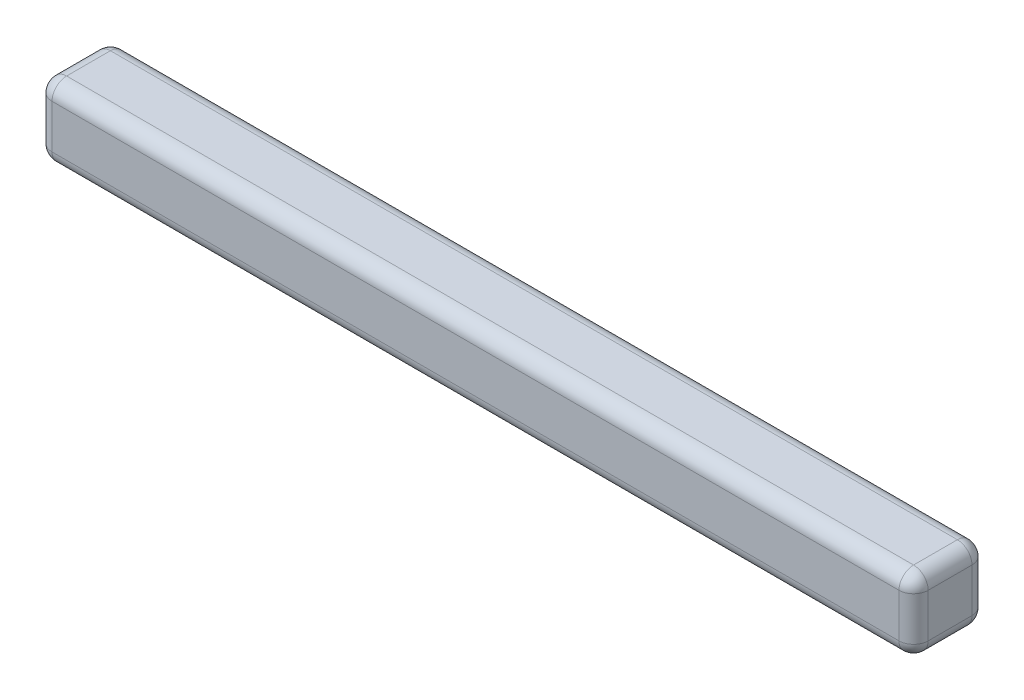
ISO-10303-21;
HEADER;
FILE_DESCRIPTION(('STEP AP214'),'2;1');
FILE_NAME('part.step','',(''),(''),'','','');
FILE_SCHEMA(('AUTOMOTIVE_DESIGN { 1 0 10303 214 1 1 1 1 }'));
ENDSEC;
DATA;
#1=APPLICATION_CONTEXT('core data for automotive mechanical design processes');
#2=APPLICATION_PROTOCOL_DEFINITION('international standard','automotive_design',2000,#1);
#3=PRODUCT_CONTEXT('',#1,'mechanical');
#4=PRODUCT('Part','Part','',(#3));
#5=PRODUCT_RELATED_PRODUCT_CATEGORY('part','',(#4));
#6=PRODUCT_DEFINITION_FORMATION('','',#4);
#7=PRODUCT_DEFINITION_CONTEXT('part definition',#1,'design');
#8=PRODUCT_DEFINITION('design','',#6,#7);
#9=PRODUCT_DEFINITION_SHAPE('','',#8);
#10=(LENGTH_UNIT() NAMED_UNIT(*) SI_UNIT(.MILLI.,.METRE.));
#11=(NAMED_UNIT(*) PLANE_ANGLE_UNIT() SI_UNIT($,.RADIAN.));
#12=(NAMED_UNIT(*) SI_UNIT($,.STERADIAN.) SOLID_ANGLE_UNIT());
#13=UNCERTAINTY_MEASURE_WITH_UNIT(LENGTH_MEASURE(1.E-05),#10,'distance_accuracy_value','');
#14=(GEOMETRIC_REPRESENTATION_CONTEXT(3) GLOBAL_UNCERTAINTY_ASSIGNED_CONTEXT((#13)) GLOBAL_UNIT_ASSIGNED_CONTEXT((#10,
#11,#12)) REPRESENTATION_CONTEXT('',''));
#15=CARTESIAN_POINT('',(0.,0.,0.));
#16=DIRECTION('',(0.,0.,1.));
#17=DIRECTION('',(1.,0.,0.));
#18=AXIS2_PLACEMENT_3D('',#15,#16,#17);
#19=CARTESIAN_POINT('',(30.,5.,-2.5));
#20=DIRECTION('',(-1.,0.,0.));
#21=DIRECTION('',(0.,0.,1.));
#22=AXIS2_PLACEMENT_3D('',#19,#20,#21);
#23=PLANE('',#22);
#24=DIRECTION('',(0.,-1.,0.));
#25=VECTOR('',#24,1.);
#26=CARTESIAN_POINT('',(30.,5.,1.5));
#27=LINE('',#26,#25);
#28=CARTESIAN_POINT('',(30.,4.,1.5));
#29=VERTEX_POINT('',#28);
#30=CARTESIAN_POINT('',(30.,1.,1.5));
#31=VERTEX_POINT('',#30);
#32=EDGE_CURVE('E132',#29,#31,#27,.T.);
#33=ORIENTED_EDGE('',*,*,#32,.T.);
#34=DIRECTION('',(0.,0.,-1.));
#35=VECTOR('',#34,1.);
#36=CARTESIAN_POINT('',(30.,1.,-2.5));
#37=LINE('',#36,#35);
#38=CARTESIAN_POINT('',(30.,1.,-1.5));
#39=VERTEX_POINT('',#38);
#40=EDGE_CURVE('E128',#31,#39,#37,.T.);
#41=ORIENTED_EDGE('',*,*,#40,.T.);
#42=DIRECTION('',(0.,-1.,0.));
#43=VECTOR('',#42,1.);
#44=CARTESIAN_POINT('',(30.,5.,-1.5));
#45=LINE('',#44,#43);
#46=CARTESIAN_POINT('',(30.,4.,-1.5));
#47=VERTEX_POINT('',#46);
#48=EDGE_CURVE('E121',#39,#47,#45,.F.);
#49=ORIENTED_EDGE('',*,*,#48,.T.);
#50=DIRECTION('',(0.,0.,-1.));
#51=VECTOR('',#50,1.);
#52=CARTESIAN_POINT('',(30.,4.,2.5));
#53=LINE('',#52,#51);
#54=EDGE_CURVE('E125',#47,#29,#53,.F.);
#55=ORIENTED_EDGE('',*,*,#54,.T.);
#56=EDGE_LOOP('',(#33,#41,#49,#55));
#57=FACE_BOUND('',#56,.T.);
#58=ADVANCED_FACE('F33',(#57),#23,.F.);
#59=CARTESIAN_POINT('',(-30.,5.,-2.5));
#60=DIRECTION('',(0.,0.,1.));
#61=DIRECTION('',(1.,0.,0.));
#62=AXIS2_PLACEMENT_3D('',#59,#60,#61);
#63=PLANE('',#62);
#64=DIRECTION('',(0.,-1.,0.));
#65=VECTOR('',#64,1.);
#66=CARTESIAN_POINT('',(29.,5.,-2.5));
#67=LINE('',#66,#65);
#68=CARTESIAN_POINT('',(29.,4.,-2.5));
#69=VERTEX_POINT('',#68);
#70=CARTESIAN_POINT('',(29.,1.,-2.5));
#71=VERTEX_POINT('',#70);
#72=EDGE_CURVE('E140',#69,#71,#67,.T.);
#73=ORIENTED_EDGE('',*,*,#72,.T.);
#74=DIRECTION('',(-1.,0.,0.));
#75=VECTOR('',#74,1.);
#76=CARTESIAN_POINT('',(-30.,1.,-2.5));
#77=LINE('',#76,#75);
#78=CARTESIAN_POINT('',(-29.,1.,-2.5));
#79=VERTEX_POINT('',#78);
#80=EDGE_CURVE('E178',#71,#79,#77,.T.);
#81=ORIENTED_EDGE('',*,*,#80,.T.);
#82=DIRECTION('',(0.,-1.,0.));
#83=VECTOR('',#82,1.);
#84=CARTESIAN_POINT('',(-29.,5.,-2.5));
#85=LINE('',#84,#83);
#86=CARTESIAN_POINT('',(-29.,4.,-2.5));
#87=VERTEX_POINT('',#86);
#88=EDGE_CURVE('E175',#79,#87,#85,.F.);
#89=ORIENTED_EDGE('',*,*,#88,.T.);
#90=DIRECTION('',(-1.,0.,0.));
#91=VECTOR('',#90,1.);
#92=CARTESIAN_POINT('',(30.,4.,-2.5));
#93=LINE('',#92,#91);
#94=EDGE_CURVE('E173',#87,#69,#93,.F.);
#95=ORIENTED_EDGE('',*,*,#94,.T.);
#96=EDGE_LOOP('',(#73,#81,#89,#95));
#97=FACE_BOUND('',#96,.T.);
#98=ADVANCED_FACE('F295',(#97),#63,.F.);
#99=CARTESIAN_POINT('',(-30.,5.,-2.5));
#100=DIRECTION('',(1.,0.,0.));
#101=DIRECTION('',(0.,0.,-1.));
#102=AXIS2_PLACEMENT_3D('',#99,#100,#101);
#103=PLANE('',#102);
#104=DIRECTION('',(0.,-1.,0.));
#105=VECTOR('',#104,1.);
#106=CARTESIAN_POINT('',(-30.,5.,-1.5));
#107=LINE('',#106,#105);
#108=CARTESIAN_POINT('',(-30.,4.,-1.5));
#109=VERTEX_POINT('',#108);
#110=CARTESIAN_POINT('',(-30.,1.,-1.5));
#111=VERTEX_POINT('',#110);
#112=EDGE_CURVE('E184',#109,#111,#107,.T.);
#113=ORIENTED_EDGE('',*,*,#112,.T.);
#114=DIRECTION('',(0.,0.,1.));
#115=VECTOR('',#114,1.);
#116=CARTESIAN_POINT('',(-30.,1.,-2.5));
#117=LINE('',#116,#115);
#118=CARTESIAN_POINT('',(-30.,1.,1.5));
#119=VERTEX_POINT('',#118);
#120=EDGE_CURVE('E187',#111,#119,#117,.T.);
#121=ORIENTED_EDGE('',*,*,#120,.T.);
#122=DIRECTION('',(0.,-1.,0.));
#123=VECTOR('',#122,1.);
#124=CARTESIAN_POINT('',(-30.,5.,1.5));
#125=LINE('',#124,#123);
#126=CARTESIAN_POINT('',(-30.,4.,1.5));
#127=VERTEX_POINT('',#126);
#128=EDGE_CURVE('E182',#119,#127,#125,.F.);
#129=ORIENTED_EDGE('',*,*,#128,.T.);
#130=DIRECTION('',(0.,0.,1.));
#131=VECTOR('',#130,1.);
#132=CARTESIAN_POINT('',(-30.,4.,-2.5));
#133=LINE('',#132,#131);
#134=EDGE_CURVE('E180',#127,#109,#133,.F.);
#135=ORIENTED_EDGE('',*,*,#134,.T.);
#136=EDGE_LOOP('',(#113,#121,#129,#135));
#137=FACE_BOUND('',#136,.T.);
#138=ADVANCED_FACE('F272',(#137),#103,.F.);
#139=CARTESIAN_POINT('',(-30.,5.,2.5));
#140=DIRECTION('',(0.,0.,-1.));
#141=DIRECTION('',(-1.,0.,0.));
#142=AXIS2_PLACEMENT_3D('',#139,#140,#141);
#143=PLANE('',#142);
#144=DIRECTION('',(0.,-1.,0.));
#145=VECTOR('',#144,1.);
#146=CARTESIAN_POINT('',(-29.,5.,2.5));
#147=LINE('',#146,#145);
#148=CARTESIAN_POINT('',(-29.,4.,2.5));
#149=VERTEX_POINT('',#148);
#150=CARTESIAN_POINT('',(-29.,1.,2.5));
#151=VERTEX_POINT('',#150);
#152=EDGE_CURVE('E166',#149,#151,#147,.T.);
#153=ORIENTED_EDGE('',*,*,#152,.T.);
#154=DIRECTION('',(1.,0.,0.));
#155=VECTOR('',#154,1.);
#156=CARTESIAN_POINT('',(-30.,1.,2.5));
#157=LINE('',#156,#155);
#158=CARTESIAN_POINT('',(29.,1.,2.5));
#159=VERTEX_POINT('',#158);
#160=EDGE_CURVE('E171',#151,#159,#157,.T.);
#161=ORIENTED_EDGE('',*,*,#160,.T.);
#162=DIRECTION('',(0.,-1.,0.));
#163=VECTOR('',#162,1.);
#164=CARTESIAN_POINT('',(29.,5.,2.5));
#165=LINE('',#164,#163);
#166=CARTESIAN_POINT('',(29.,4.,2.5));
#167=VERTEX_POINT('',#166);
#168=EDGE_CURVE('E168',#159,#167,#165,.F.);
#169=ORIENTED_EDGE('',*,*,#168,.T.);
#170=DIRECTION('',(1.,0.,0.));
#171=VECTOR('',#170,1.);
#172=CARTESIAN_POINT('',(-30.,4.,2.5));
#173=LINE('',#172,#171);
#174=EDGE_CURVE('E164',#167,#149,#173,.F.);
#175=ORIENTED_EDGE('',*,*,#174,.T.);
#176=EDGE_LOOP('',(#153,#161,#169,#175));
#177=FACE_BOUND('',#176,.T.);
#178=ADVANCED_FACE('F302',(#177),#143,.F.);
#179=CARTESIAN_POINT('',(0.,5.,0.));
#180=DIRECTION('',(0.,1.,0.));
#181=DIRECTION('',(0.,0.,1.));
#182=AXIS2_PLACEMENT_3D('',#179,#180,#181);
#183=PLANE('',#182);
#184=DIRECTION('',(0.,0.,1.));
#185=VECTOR('',#184,1.);
#186=CARTESIAN_POINT('',(-29.,5.,2.5));
#187=LINE('',#186,#185);
#188=CARTESIAN_POINT('',(-29.,5.,-1.5));
#189=VERTEX_POINT('',#188);
#190=CARTESIAN_POINT('',(-29.,5.,1.5));
#191=VERTEX_POINT('',#190);
#192=EDGE_CURVE('E42',#189,#191,#187,.T.);
#193=ORIENTED_EDGE('',*,*,#192,.T.);
#194=DIRECTION('',(1.,0.,0.));
#195=VECTOR('',#194,1.);
#196=CARTESIAN_POINT('',(30.,5.,1.5));
#197=LINE('',#196,#195);
#198=CARTESIAN_POINT('',(29.,5.,1.5));
#199=VERTEX_POINT('',#198);
#200=EDGE_CURVE('E11',#191,#199,#197,.T.);
#201=ORIENTED_EDGE('',*,*,#200,.T.);
#202=DIRECTION('',(0.,0.,-1.));
#203=VECTOR('',#202,1.);
#204=CARTESIAN_POINT('',(29.,5.,-2.5));
#205=LINE('',#204,#203);
#206=CARTESIAN_POINT('',(29.,5.,-1.5));
#207=VERTEX_POINT('',#206);
#208=EDGE_CURVE('E198',#199,#207,#205,.T.);
#209=ORIENTED_EDGE('',*,*,#208,.T.);
#210=DIRECTION('',(-1.,0.,0.));
#211=VECTOR('',#210,1.);
#212=CARTESIAN_POINT('',(-30.,5.,-1.5));
#213=LINE('',#212,#211);
#214=EDGE_CURVE('E53',#207,#189,#213,.T.);
#215=ORIENTED_EDGE('',*,*,#214,.T.);
#216=EDGE_LOOP('',(#193,#201,#209,#215));
#217=FACE_BOUND('',#216,.T.);
#218=ADVANCED_FACE('F365',(#217),#183,.T.);
#219=CARTESIAN_POINT('',(0.,0.,0.));
#220=DIRECTION('',(0.,1.,0.));
#221=DIRECTION('',(0.,0.,1.));
#222=AXIS2_PLACEMENT_3D('',#219,#220,#221);
#223=PLANE('',#222);
#224=DIRECTION('',(0.,0.,1.));
#225=VECTOR('',#224,1.);
#226=CARTESIAN_POINT('',(-29.,0.,0.));
#227=LINE('',#226,#225);
#228=CARTESIAN_POINT('',(-29.,0.,1.5));
#229=VERTEX_POINT('',#228);
#230=CARTESIAN_POINT('',(-29.,0.,-1.5));
#231=VERTEX_POINT('',#230);
#232=EDGE_CURVE('E193',#229,#231,#227,.F.);
#233=ORIENTED_EDGE('',*,*,#232,.T.);
#234=DIRECTION('',(-1.,0.,0.));
#235=VECTOR('',#234,1.);
#236=CARTESIAN_POINT('',(0.,0.,-1.5));
#237=LINE('',#236,#235);
#238=CARTESIAN_POINT('',(29.,0.,-1.5));
#239=VERTEX_POINT('',#238);
#240=EDGE_CURVE('E195',#231,#239,#237,.F.);
#241=ORIENTED_EDGE('',*,*,#240,.T.);
#242=DIRECTION('',(0.,0.,-1.));
#243=VECTOR('',#242,1.);
#244=CARTESIAN_POINT('',(29.,0.,0.));
#245=LINE('',#244,#243);
#246=CARTESIAN_POINT('',(29.,0.,1.5));
#247=VERTEX_POINT('',#246);
#248=EDGE_CURVE('E189',#239,#247,#245,.F.);
#249=ORIENTED_EDGE('',*,*,#248,.T.);
#250=DIRECTION('',(1.,0.,0.));
#251=VECTOR('',#250,1.);
#252=CARTESIAN_POINT('',(0.,0.,1.5));
#253=LINE('',#252,#251);
#254=EDGE_CURVE('E191',#247,#229,#253,.F.);
#255=ORIENTED_EDGE('',*,*,#254,.T.);
#256=EDGE_LOOP('',(#233,#241,#249,#255));
#257=FACE_BOUND('',#256,.T.);
#258=ADVANCED_FACE('F264',(#257),#223,.F.);
#259=CARTESIAN_POINT('',(-29.,5.,-1.5));
#260=DIRECTION('',(0.,-1.,0.));
#261=DIRECTION('',(0.,0.,-1.));
#262=AXIS2_PLACEMENT_3D('',#259,#260,#261);
#263=CYLINDRICAL_SURFACE('',#262,1.);
#264=CARTESIAN_POINT('',(-29.,4.,-1.5));
#265=DIRECTION('',(0.,1.,0.));
#266=DIRECTION('',(0.,0.,1.));
#267=AXIS2_PLACEMENT_3D('',#264,#265,#266);
#268=CIRCLE('',#267,1.);
#269=EDGE_CURVE('E37',#87,#109,#268,.T.);
#270=ORIENTED_EDGE('',*,*,#269,.F.);
#271=ORIENTED_EDGE('',*,*,#88,.F.);
#272=CARTESIAN_POINT('',(-29.,1.,-1.5));
#273=DIRECTION('',(0.,-1.,0.));
#274=DIRECTION('',(0.,0.,-1.));
#275=AXIS2_PLACEMENT_3D('',#272,#273,#274);
#276=CIRCLE('',#275,1.);
#277=EDGE_CURVE('E160',#111,#79,#276,.T.);
#278=ORIENTED_EDGE('',*,*,#277,.F.);
#279=ORIENTED_EDGE('',*,*,#112,.F.);
#280=EDGE_LOOP('',(#270,#271,#278,#279));
#281=FACE_BOUND('',#280,.T.);
#282=ADVANCED_FACE('F35',(#281),#263,.T.);
#283=CARTESIAN_POINT('',(-29.,4.,-1.5));
#284=DIRECTION('',(0.,0.,1.));
#285=DIRECTION('',(1.,0.,0.));
#286=AXIS2_PLACEMENT_3D('',#283,#284,#285);
#287=SPHERICAL_SURFACE('',#286,1.);
#288=CARTESIAN_POINT('',(-29.,4.,-1.5));
#289=DIRECTION('',(-1.,0.,0.));
#290=DIRECTION('',(0.,0.,1.));
#291=AXIS2_PLACEMENT_3D('',#288,#289,#290);
#292=CIRCLE('',#291,1.);
#293=EDGE_CURVE('E245',#87,#189,#292,.F.);
#294=ORIENTED_EDGE('',*,*,#293,.F.);
#295=ORIENTED_EDGE('',*,*,#269,.T.);
#296=CARTESIAN_POINT('',(-29.,4.,-1.5));
#297=DIRECTION('',(0.,0.,-1.));
#298=DIRECTION('',(-1.,0.,0.));
#299=AXIS2_PLACEMENT_3D('',#296,#297,#298);
#300=CIRCLE('',#299,1.);
#301=EDGE_CURVE('E247',#189,#109,#300,.F.);
#302=ORIENTED_EDGE('',*,*,#301,.F.);
#303=EDGE_LOOP('',(#294,#295,#302));
#304=FACE_BOUND('',#303,.T.);
#305=ADVANCED_FACE('F290',(#304),#287,.T.);
#306=CARTESIAN_POINT('',(-29.,1.,-1.5));
#307=DIRECTION('',(0.,0.,1.));
#308=DIRECTION('',(1.,0.,0.));
#309=AXIS2_PLACEMENT_3D('',#306,#307,#308);
#310=SPHERICAL_SURFACE('',#309,1.);
#311=CARTESIAN_POINT('',(-29.,1.,-1.5));
#312=DIRECTION('',(0.,0.,-1.));
#313=DIRECTION('',(-1.,0.,0.));
#314=AXIS2_PLACEMENT_3D('',#311,#312,#313);
#315=CIRCLE('',#314,1.);
#316=EDGE_CURVE('E239',#111,#231,#315,.F.);
#317=ORIENTED_EDGE('',*,*,#316,.F.);
#318=ORIENTED_EDGE('',*,*,#277,.T.);
#319=CARTESIAN_POINT('',(-29.,1.,-1.5));
#320=DIRECTION('',(-1.,0.,0.));
#321=DIRECTION('',(0.,0.,1.));
#322=AXIS2_PLACEMENT_3D('',#319,#320,#321);
#323=CIRCLE('',#322,1.);
#324=EDGE_CURVE('E242',#231,#79,#323,.F.);
#325=ORIENTED_EDGE('',*,*,#324,.F.);
#326=EDGE_LOOP('',(#317,#318,#325));
#327=FACE_BOUND('',#326,.T.);
#328=ADVANCED_FACE('F254',(#327),#310,.T.);
#329=CARTESIAN_POINT('',(-29.,4.,0.));
#330=DIRECTION('',(0.,0.,-1.));
#331=DIRECTION('',(-1.,0.,0.));
#332=AXIS2_PLACEMENT_3D('',#329,#330,#331);
#333=CYLINDRICAL_SURFACE('',#332,1.);
#334=ORIENTED_EDGE('',*,*,#301,.T.);
#335=ORIENTED_EDGE('',*,*,#134,.F.);
#336=CARTESIAN_POINT('',(-29.,4.,1.5));
#337=DIRECTION('',(0.,0.,1.));
#338=DIRECTION('',(1.,0.,0.));
#339=AXIS2_PLACEMENT_3D('',#336,#337,#338);
#340=CIRCLE('',#339,1.);
#341=EDGE_CURVE('E233',#191,#127,#340,.T.);
#342=ORIENTED_EDGE('',*,*,#341,.F.);
#343=ORIENTED_EDGE('',*,*,#192,.F.);
#344=EDGE_LOOP('',(#334,#335,#342,#343));
#345=FACE_BOUND('',#344,.T.);
#346=ADVANCED_FACE('F285',(#345),#333,.T.);
#347=CARTESIAN_POINT('',(0.,4.,-1.5));
#348=DIRECTION('',(1.,0.,0.));
#349=DIRECTION('',(0.,0.,-1.));
#350=AXIS2_PLACEMENT_3D('',#347,#348,#349);
#351=CYLINDRICAL_SURFACE('',#350,1.);
#352=ORIENTED_EDGE('',*,*,#293,.T.);
#353=ORIENTED_EDGE('',*,*,#214,.F.);
#354=CARTESIAN_POINT('',(29.,4.,-1.5));
#355=DIRECTION('',(1.,0.,0.));
#356=DIRECTION('',(0.,1.,0.));
#357=AXIS2_PLACEMENT_3D('',#354,#355,#356);
#358=CIRCLE('',#357,1.);
#359=EDGE_CURVE('E144',#69,#207,#358,.T.);
#360=ORIENTED_EDGE('',*,*,#359,.F.);
#361=ORIENTED_EDGE('',*,*,#94,.F.);
#362=EDGE_LOOP('',(#352,#353,#360,#361));
#363=FACE_BOUND('',#362,.T.);
#364=ADVANCED_FACE('F293',(#363),#351,.T.);
#365=CARTESIAN_POINT('',(29.,5.,-1.5));
#366=DIRECTION('',(0.,-1.,0.));
#367=DIRECTION('',(0.,0.,-1.));
#368=AXIS2_PLACEMENT_3D('',#365,#366,#367);
#369=CYLINDRICAL_SURFACE('',#368,1.);
#370=CARTESIAN_POINT('',(29.,1.,-1.5));
#371=DIRECTION('',(0.,-1.,0.));
#372=DIRECTION('',(0.,0.,-1.));
#373=AXIS2_PLACEMENT_3D('',#370,#371,#372);
#374=CIRCLE('',#373,1.);
#375=EDGE_CURVE('E145',#71,#39,#374,.T.);
#376=ORIENTED_EDGE('',*,*,#375,.F.);
#377=ORIENTED_EDGE('',*,*,#72,.F.);
#378=CARTESIAN_POINT('',(29.,4.,-1.5));
#379=DIRECTION('',(0.,1.,0.));
#380=DIRECTION('',(0.,0.,1.));
#381=AXIS2_PLACEMENT_3D('',#378,#379,#380);
#382=CIRCLE('',#381,1.);
#383=EDGE_CURVE('E136',#47,#69,#382,.T.);
#384=ORIENTED_EDGE('',*,*,#383,.F.);
#385=ORIENTED_EDGE('',*,*,#48,.F.);
#386=EDGE_LOOP('',(#376,#377,#384,#385));
#387=FACE_BOUND('',#386,.T.);
#388=ADVANCED_FACE('F138',(#387),#369,.T.);
#389=CARTESIAN_POINT('',(-30.,1.,-1.5));
#390=DIRECTION('',(-1.,0.,0.));
#391=DIRECTION('',(0.,0.,1.));
#392=AXIS2_PLACEMENT_3D('',#389,#390,#391);
#393=CYLINDRICAL_SURFACE('',#392,1.);
#394=ORIENTED_EDGE('',*,*,#324,.T.);
#395=ORIENTED_EDGE('',*,*,#80,.F.);
#396=CARTESIAN_POINT('',(29.,1.,-1.5));
#397=DIRECTION('',(1.,0.,0.));
#398=DIRECTION('',(0.,0.,-1.));
#399=AXIS2_PLACEMENT_3D('',#396,#397,#398);
#400=CIRCLE('',#399,1.);
#401=EDGE_CURVE('E229',#239,#71,#400,.T.);
#402=ORIENTED_EDGE('',*,*,#401,.F.);
#403=ORIENTED_EDGE('',*,*,#240,.F.);
#404=EDGE_LOOP('',(#394,#395,#402,#403));
#405=FACE_BOUND('',#404,.T.);
#406=ADVANCED_FACE('F261',(#405),#393,.T.);
#407=CARTESIAN_POINT('',(-29.,1.,-2.5));
#408=DIRECTION('',(0.,0.,1.));
#409=DIRECTION('',(1.,0.,0.));
#410=AXIS2_PLACEMENT_3D('',#407,#408,#409);
#411=CYLINDRICAL_SURFACE('',#410,1.);
#412=ORIENTED_EDGE('',*,*,#316,.T.);
#413=ORIENTED_EDGE('',*,*,#232,.F.);
#414=CARTESIAN_POINT('',(-29.,1.,1.5));
#415=DIRECTION('',(0.,0.,1.));
#416=DIRECTION('',(1.,0.,0.));
#417=AXIS2_PLACEMENT_3D('',#414,#415,#416);
#418=CIRCLE('',#417,1.);
#419=EDGE_CURVE('E226',#119,#229,#418,.T.);
#420=ORIENTED_EDGE('',*,*,#419,.F.);
#421=ORIENTED_EDGE('',*,*,#120,.F.);
#422=EDGE_LOOP('',(#412,#413,#420,#421));
#423=FACE_BOUND('',#422,.T.);
#424=ADVANCED_FACE('F269',(#423),#411,.T.);
#425=CARTESIAN_POINT('',(-29.,5.,1.5));
#426=DIRECTION('',(0.,-1.,0.));
#427=DIRECTION('',(0.,0.,-1.));
#428=AXIS2_PLACEMENT_3D('',#425,#426,#427);
#429=CYLINDRICAL_SURFACE('',#428,1.);
#430=CARTESIAN_POINT('',(-29.,4.,1.5));
#431=DIRECTION('',(0.,1.,0.));
#432=DIRECTION('',(0.,0.,1.));
#433=AXIS2_PLACEMENT_3D('',#430,#431,#432);
#434=CIRCLE('',#433,1.);
#435=EDGE_CURVE('E236',#127,#149,#434,.T.);
#436=ORIENTED_EDGE('',*,*,#435,.F.);
#437=ORIENTED_EDGE('',*,*,#128,.F.);
#438=CARTESIAN_POINT('',(-29.,1.,1.5));
#439=DIRECTION('',(0.,-1.,0.));
#440=DIRECTION('',(0.,0.,-1.));
#441=AXIS2_PLACEMENT_3D('',#438,#439,#440);
#442=CIRCLE('',#441,1.);
#443=EDGE_CURVE('E223',#151,#119,#442,.T.);
#444=ORIENTED_EDGE('',*,*,#443,.F.);
#445=ORIENTED_EDGE('',*,*,#152,.F.);
#446=EDGE_LOOP('',(#436,#437,#444,#445));
#447=FACE_BOUND('',#446,.T.);
#448=ADVANCED_FACE('F277',(#447),#429,.T.);
#449=CARTESIAN_POINT('',(-29.,4.,1.5));
#450=DIRECTION('',(0.,0.,1.));
#451=DIRECTION('',(1.,0.,0.));
#452=AXIS2_PLACEMENT_3D('',#449,#450,#451);
#453=SPHERICAL_SURFACE('',#452,1.);
#454=ORIENTED_EDGE('',*,*,#341,.T.);
#455=ORIENTED_EDGE('',*,*,#435,.T.);
#456=CARTESIAN_POINT('',(-29.,4.,1.5));
#457=DIRECTION('',(-1.,0.,0.));
#458=DIRECTION('',(0.,0.,1.));
#459=AXIS2_PLACEMENT_3D('',#456,#457,#458);
#460=CIRCLE('',#459,1.);
#461=EDGE_CURVE('E152',#191,#149,#460,.F.);
#462=ORIENTED_EDGE('',*,*,#461,.F.);
#463=EDGE_LOOP('',(#454,#455,#462));
#464=FACE_BOUND('',#463,.T.);
#465=ADVANCED_FACE('F282',(#464),#453,.T.);
#466=CARTESIAN_POINT('',(29.,4.,-1.5));
#467=DIRECTION('',(0.,0.,1.));
#468=DIRECTION('',(1.,0.,0.));
#469=AXIS2_PLACEMENT_3D('',#466,#467,#468);
#470=SPHERICAL_SURFACE('',#469,1.);
#471=ORIENTED_EDGE('',*,*,#383,.T.);
#472=ORIENTED_EDGE('',*,*,#359,.T.);
#473=CARTESIAN_POINT('',(29.,4.,-1.5));
#474=DIRECTION('',(0.,0.,-1.));
#475=DIRECTION('',(-1.,0.,0.));
#476=AXIS2_PLACEMENT_3D('',#473,#474,#475);
#477=CIRCLE('',#476,1.);
#478=EDGE_CURVE('E148',#47,#207,#477,.F.);
#479=ORIENTED_EDGE('',*,*,#478,.F.);
#480=EDGE_LOOP('',(#471,#472,#479));
#481=FACE_BOUND('',#480,.T.);
#482=ADVANCED_FACE('F149',(#481),#470,.T.);
#483=CARTESIAN_POINT('',(29.,1.,-1.5));
#484=DIRECTION('',(0.,0.,1.));
#485=DIRECTION('',(1.,0.,0.));
#486=AXIS2_PLACEMENT_3D('',#483,#484,#485);
#487=SPHERICAL_SURFACE('',#486,1.);
#488=ORIENTED_EDGE('',*,*,#401,.T.);
#489=ORIENTED_EDGE('',*,*,#375,.T.);
#490=CARTESIAN_POINT('',(29.,1.,-1.5));
#491=DIRECTION('',(0.,0.,-1.));
#492=DIRECTION('',(-1.,0.,0.));
#493=AXIS2_PLACEMENT_3D('',#490,#491,#492);
#494=CIRCLE('',#493,1.);
#495=EDGE_CURVE('E153',#239,#39,#494,.F.);
#496=ORIENTED_EDGE('',*,*,#495,.F.);
#497=EDGE_LOOP('',(#488,#489,#496));
#498=FACE_BOUND('',#497,.T.);
#499=ADVANCED_FACE('F336',(#498),#487,.T.);
#500=CARTESIAN_POINT('',(-29.,1.,1.5));
#501=DIRECTION('',(0.,0.,1.));
#502=DIRECTION('',(1.,0.,0.));
#503=AXIS2_PLACEMENT_3D('',#500,#501,#502);
#504=SPHERICAL_SURFACE('',#503,1.);
#505=ORIENTED_EDGE('',*,*,#443,.T.);
#506=ORIENTED_EDGE('',*,*,#419,.T.);
#507=CARTESIAN_POINT('',(-29.,1.,1.5));
#508=DIRECTION('',(-1.,0.,0.));
#509=DIRECTION('',(0.,0.,1.));
#510=AXIS2_PLACEMENT_3D('',#507,#508,#509);
#511=CIRCLE('',#510,1.);
#512=EDGE_CURVE('E216',#151,#229,#511,.F.);
#513=ORIENTED_EDGE('',*,*,#512,.F.);
#514=EDGE_LOOP('',(#505,#506,#513));
#515=FACE_BOUND('',#514,.T.);
#516=ADVANCED_FACE('F332',(#515),#504,.T.);
#517=CARTESIAN_POINT('',(0.,4.,1.5));
#518=DIRECTION('',(-1.,0.,0.));
#519=DIRECTION('',(0.,0.,1.));
#520=AXIS2_PLACEMENT_3D('',#517,#518,#519);
#521=CYLINDRICAL_SURFACE('',#520,1.);
#522=ORIENTED_EDGE('',*,*,#461,.T.);
#523=ORIENTED_EDGE('',*,*,#174,.F.);
#524=CARTESIAN_POINT('',(29.,4.,1.5));
#525=DIRECTION('',(1.,0.,0.));
#526=DIRECTION('',(0.,0.,-1.));
#527=AXIS2_PLACEMENT_3D('',#524,#525,#526);
#528=CIRCLE('',#527,1.);
#529=EDGE_CURVE('E213',#199,#167,#528,.T.);
#530=ORIENTED_EDGE('',*,*,#529,.F.);
#531=ORIENTED_EDGE('',*,*,#200,.F.);
#532=EDGE_LOOP('',(#522,#523,#530,#531));
#533=FACE_BOUND('',#532,.T.);
#534=ADVANCED_FACE('F329',(#533),#521,.T.);
#535=CARTESIAN_POINT('',(29.,4.,0.));
#536=DIRECTION('',(0.,0.,1.));
#537=DIRECTION('',(1.,0.,0.));
#538=AXIS2_PLACEMENT_3D('',#535,#536,#537);
#539=CYLINDRICAL_SURFACE('',#538,1.);
#540=ORIENTED_EDGE('',*,*,#478,.T.);
#541=ORIENTED_EDGE('',*,*,#208,.F.);
#542=CARTESIAN_POINT('',(29.,4.,1.5));
#543=DIRECTION('',(0.,0.,1.));
#544=DIRECTION('',(1.,0.,0.));
#545=AXIS2_PLACEMENT_3D('',#542,#543,#544);
#546=CIRCLE('',#545,1.);
#547=EDGE_CURVE('E156',#29,#199,#546,.T.);
#548=ORIENTED_EDGE('',*,*,#547,.F.);
#549=ORIENTED_EDGE('',*,*,#54,.F.);
#550=EDGE_LOOP('',(#540,#541,#548,#549));
#551=FACE_BOUND('',#550,.T.);
#552=ADVANCED_FACE('F155',(#551),#539,.T.);
#553=CARTESIAN_POINT('',(29.,1.,-2.5));
#554=DIRECTION('',(0.,0.,-1.));
#555=DIRECTION('',(-1.,0.,0.));
#556=AXIS2_PLACEMENT_3D('',#553,#554,#555);
#557=CYLINDRICAL_SURFACE('',#556,1.);
#558=ORIENTED_EDGE('',*,*,#495,.T.);
#559=ORIENTED_EDGE('',*,*,#40,.F.);
#560=CARTESIAN_POINT('',(29.,1.,1.5));
#561=DIRECTION('',(0.,0.,1.));
#562=DIRECTION('',(1.,0.,0.));
#563=AXIS2_PLACEMENT_3D('',#560,#561,#562);
#564=CIRCLE('',#563,1.);
#565=EDGE_CURVE('E209',#247,#31,#564,.T.);
#566=ORIENTED_EDGE('',*,*,#565,.F.);
#567=ORIENTED_EDGE('',*,*,#248,.F.);
#568=EDGE_LOOP('',(#558,#559,#566,#567));
#569=FACE_BOUND('',#568,.T.);
#570=ADVANCED_FACE('F322',(#569),#557,.T.);
#571=CARTESIAN_POINT('',(-30.,1.,1.5));
#572=DIRECTION('',(1.,0.,0.));
#573=DIRECTION('',(0.,0.,-1.));
#574=AXIS2_PLACEMENT_3D('',#571,#572,#573);
#575=CYLINDRICAL_SURFACE('',#574,1.);
#576=ORIENTED_EDGE('',*,*,#512,.T.);
#577=ORIENTED_EDGE('',*,*,#254,.F.);
#578=CARTESIAN_POINT('',(29.,1.,1.5));
#579=DIRECTION('',(1.,0.,0.));
#580=DIRECTION('',(0.,0.,-1.));
#581=AXIS2_PLACEMENT_3D('',#578,#579,#580);
#582=CIRCLE('',#581,1.);
#583=EDGE_CURVE('E206',#159,#247,#582,.T.);
#584=ORIENTED_EDGE('',*,*,#583,.F.);
#585=ORIENTED_EDGE('',*,*,#160,.F.);
#586=EDGE_LOOP('',(#576,#577,#584,#585));
#587=FACE_BOUND('',#586,.T.);
#588=ADVANCED_FACE('F318',(#587),#575,.T.);
#589=CARTESIAN_POINT('',(29.,4.,1.5));
#590=DIRECTION('',(0.,0.,1.));
#591=DIRECTION('',(1.,0.,0.));
#592=AXIS2_PLACEMENT_3D('',#589,#590,#591);
#593=SPHERICAL_SURFACE('',#592,1.);
#594=ORIENTED_EDGE('',*,*,#547,.T.);
#595=ORIENTED_EDGE('',*,*,#529,.T.);
#596=CARTESIAN_POINT('',(29.,4.,1.5));
#597=DIRECTION('',(0.,1.,0.));
#598=DIRECTION('',(0.,0.,1.));
#599=AXIS2_PLACEMENT_3D('',#596,#597,#598);
#600=CIRCLE('',#599,1.);
#601=EDGE_CURVE('E204',#29,#167,#600,.F.);
#602=ORIENTED_EDGE('',*,*,#601,.F.);
#603=EDGE_LOOP('',(#594,#595,#602));
#604=FACE_BOUND('',#603,.T.);
#605=ADVANCED_FACE('F314',(#604),#593,.T.);
#606=CARTESIAN_POINT('',(29.,1.,1.5));
#607=DIRECTION('',(0.,0.,1.));
#608=DIRECTION('',(1.,0.,0.));
#609=AXIS2_PLACEMENT_3D('',#606,#607,#608);
#610=SPHERICAL_SURFACE('',#609,1.);
#611=ORIENTED_EDGE('',*,*,#583,.T.);
#612=ORIENTED_EDGE('',*,*,#565,.T.);
#613=CARTESIAN_POINT('',(29.,1.,1.5));
#614=DIRECTION('',(0.,-1.,0.));
#615=DIRECTION('',(0.,0.,-1.));
#616=AXIS2_PLACEMENT_3D('',#613,#614,#615);
#617=CIRCLE('',#616,1.);
#618=EDGE_CURVE('E202',#159,#31,#617,.F.);
#619=ORIENTED_EDGE('',*,*,#618,.F.);
#620=EDGE_LOOP('',(#611,#612,#619));
#621=FACE_BOUND('',#620,.T.);
#622=ADVANCED_FACE('F310',(#621),#610,.T.);
#623=CARTESIAN_POINT('',(29.,5.,1.5));
#624=DIRECTION('',(0.,-1.,0.));
#625=DIRECTION('',(0.,0.,-1.));
#626=AXIS2_PLACEMENT_3D('',#623,#624,#625);
#627=CYLINDRICAL_SURFACE('',#626,1.);
#628=ORIENTED_EDGE('',*,*,#601,.T.);
#629=ORIENTED_EDGE('',*,*,#168,.F.);
#630=ORIENTED_EDGE('',*,*,#618,.T.);
#631=ORIENTED_EDGE('',*,*,#32,.F.);
#632=EDGE_LOOP('',(#628,#629,#630,#631));
#633=FACE_BOUND('',#632,.T.);
#634=ADVANCED_FACE('F307',(#633),#627,.T.);
#635=CLOSED_SHELL('',(#58,#98,#138,#178,#218,#258,#282,#305,#328,#346,#364,#388,#406,#424,#448,
#465,#482,#499,#516,#534,#552,#570,#588,#605,#622,#634));
#636=MANIFOLD_SOLID_BREP('B2',#635);
#637=ADVANCED_BREP_SHAPE_REPRESENTATION('',(#18,#636),#14);
#638=SHAPE_DEFINITION_REPRESENTATION(#9,#637);
ENDSEC;
END-ISO-10303-21;
